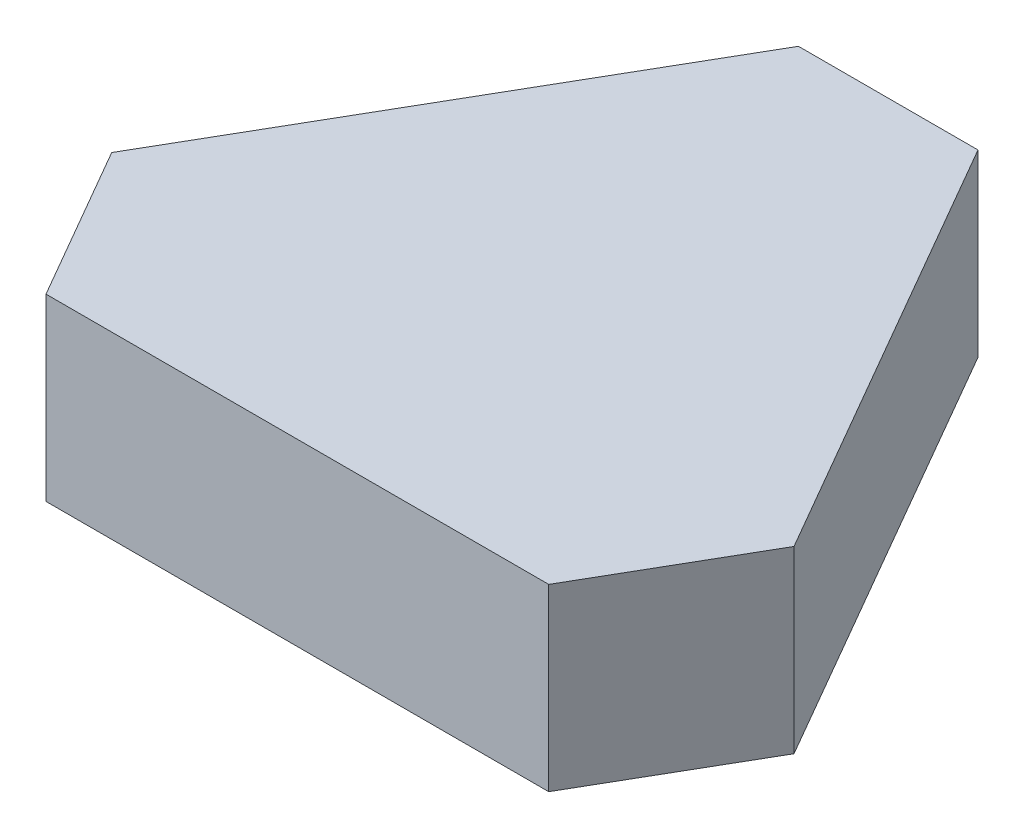
ISO-10303-21;
HEADER;
FILE_DESCRIPTION(('STEP AP214'),'2;1');
FILE_NAME('part.step','',(''),(''),'','','');
FILE_SCHEMA(('AUTOMOTIVE_DESIGN { 1 0 10303 214 1 1 1 1 }'));
ENDSEC;
DATA;
#1=APPLICATION_CONTEXT('core data for automotive mechanical design processes');
#2=APPLICATION_PROTOCOL_DEFINITION('international standard','automotive_design',2000,#1);
#3=PRODUCT_CONTEXT('',#1,'mechanical');
#4=PRODUCT('Part','Part','',(#3));
#5=PRODUCT_RELATED_PRODUCT_CATEGORY('part','',(#4));
#6=PRODUCT_DEFINITION_FORMATION('','',#4);
#7=PRODUCT_DEFINITION_CONTEXT('part definition',#1,'design');
#8=PRODUCT_DEFINITION('design','',#6,#7);
#9=PRODUCT_DEFINITION_SHAPE('','',#8);
#10=(LENGTH_UNIT() NAMED_UNIT(*) SI_UNIT(.MILLI.,.METRE.));
#11=(NAMED_UNIT(*) PLANE_ANGLE_UNIT() SI_UNIT($,.RADIAN.));
#12=(NAMED_UNIT(*) SI_UNIT($,.STERADIAN.) SOLID_ANGLE_UNIT());
#13=UNCERTAINTY_MEASURE_WITH_UNIT(LENGTH_MEASURE(1.E-05),#10,'distance_accuracy_value','');
#14=(GEOMETRIC_REPRESENTATION_CONTEXT(3) GLOBAL_UNCERTAINTY_ASSIGNED_CONTEXT((#13)) GLOBAL_UNIT_ASSIGNED_CONTEXT((#10,
#11,#12)) REPRESENTATION_CONTEXT('',''));
#15=CARTESIAN_POINT('',(0.,0.,0.));
#16=DIRECTION('',(0.,0.,1.));
#17=DIRECTION('',(1.,0.,0.));
#18=AXIS2_PLACEMENT_3D('',#15,#16,#17);
#19=CARTESIAN_POINT('',(24.,5.,13.856406460551));
#20=DIRECTION('',(0.,0.,-1.));
#21=DIRECTION('',(-1.,0.,0.));
#22=AXIS2_PLACEMENT_3D('',#19,#20,#21);
#23=PLANE('',#22);
#24=DIRECTION('',(1.,0.,0.));
#25=VECTOR('',#24,1.);
#26=CARTESIAN_POINT('',(24.,5.,13.856406460551));
#27=LINE('',#26,#25);
#28=CARTESIAN_POINT('',(-13.9999999999999,5.,13.8564064605511));
#29=VERTEX_POINT('',#28);
#30=CARTESIAN_POINT('',(14.,5.,13.856406460551));
#31=VERTEX_POINT('',#30);
#32=EDGE_CURVE('E119',#29,#31,#27,.T.);
#33=ORIENTED_EDGE('',*,*,#32,.F.);
#34=DIRECTION('',(0.,1.,0.));
#35=VECTOR('',#34,1.);
#36=CARTESIAN_POINT('',(-13.9999999999999,-18.228756555323,13.8564064605511));
#37=LINE('',#36,#35);
#38=CARTESIAN_POINT('',(-13.9999999999999,-5.,13.8564064605511));
#39=VERTEX_POINT('',#38);
#40=EDGE_CURVE('E148',#39,#29,#37,.T.);
#41=ORIENTED_EDGE('',*,*,#40,.F.);
#42=DIRECTION('',(1.,0.,0.));
#43=VECTOR('',#42,1.);
#44=CARTESIAN_POINT('',(24.,-5.,13.856406460551));
#45=LINE('',#44,#43);
#46=CARTESIAN_POINT('',(14.,-5.,13.856406460551));
#47=VERTEX_POINT('',#46);
#48=EDGE_CURVE('E124',#39,#47,#45,.T.);
#49=ORIENTED_EDGE('',*,*,#48,.T.);
#50=DIRECTION('',(0.,1.,0.));
#51=VECTOR('',#50,1.);
#52=CARTESIAN_POINT('',(14.,-18.228756555323,13.856406460551));
#53=LINE('',#52,#51);
#54=EDGE_CURVE('E128',#47,#31,#53,.T.);
#55=ORIENTED_EDGE('',*,*,#54,.T.);
#56=EDGE_LOOP('',(#33,#41,#49,#55));
#57=FACE_BOUND('',#56,.T.);
#58=ADVANCED_FACE('F45',(#57),#23,.F.);
#59=CARTESIAN_POINT('',(0.,5.,-27.712812921102));
#60=DIRECTION('',(-0.866025403784439,0.,0.5));
#61=DIRECTION('',(0.5,0.,0.866025403784439));
#62=AXIS2_PLACEMENT_3D('',#59,#60,#61);
#63=PLANE('',#62);
#64=DIRECTION('',(-0.5,0.,-0.866025403784439));
#65=VECTOR('',#64,1.);
#66=CARTESIAN_POINT('',(0.,-5.,-27.712812921102));
#67=LINE('',#66,#65);
#68=CARTESIAN_POINT('',(19.,-5.,5.19615242270663));
#69=VERTEX_POINT('',#68);
#70=CARTESIAN_POINT('',(4.99999999999997,-5.,-19.0525588832577));
#71=VERTEX_POINT('',#70);
#72=EDGE_CURVE('E120',#69,#71,#67,.T.);
#73=ORIENTED_EDGE('',*,*,#72,.T.);
#74=DIRECTION('',(0.,1.,0.));
#75=VECTOR('',#74,1.);
#76=CARTESIAN_POINT('',(4.99999999999992,-18.228756555323,-19.0525588832577));
#77=LINE('',#76,#75);
#78=CARTESIAN_POINT('',(4.99999999999992,5.,-19.0525588832577));
#79=VERTEX_POINT('',#78);
#80=EDGE_CURVE('E62',#71,#79,#77,.T.);
#81=ORIENTED_EDGE('',*,*,#80,.T.);
#82=DIRECTION('',(-0.5,0.,-0.866025403784439));
#83=VECTOR('',#82,1.);
#84=CARTESIAN_POINT('',(0.,5.,-27.712812921102));
#85=LINE('',#84,#83);
#86=CARTESIAN_POINT('',(19.,5.,5.19615242270663));
#87=VERTEX_POINT('',#86);
#88=EDGE_CURVE('E54',#87,#79,#85,.T.);
#89=ORIENTED_EDGE('',*,*,#88,.F.);
#90=DIRECTION('',(0.,1.,0.));
#91=VECTOR('',#90,1.);
#92=CARTESIAN_POINT('',(19.,-18.228756555323,5.19615242270663));
#93=LINE('',#92,#91);
#94=EDGE_CURVE('E134',#69,#87,#93,.T.);
#95=ORIENTED_EDGE('',*,*,#94,.F.);
#96=EDGE_LOOP('',(#73,#81,#89,#95));
#97=FACE_BOUND('',#96,.T.);
#98=ADVANCED_FACE('F163',(#97),#63,.F.);
#99=CARTESIAN_POINT('',(-24.,5.,13.856406460551));
#100=DIRECTION('',(0.866025403784439,0.,0.5));
#101=DIRECTION('',(0.5,0.,-0.866025403784439));
#102=AXIS2_PLACEMENT_3D('',#99,#100,#101);
#103=PLANE('',#102);
#104=DIRECTION('',(-0.5,0.,0.866025403784438));
#105=VECTOR('',#104,1.);
#106=CARTESIAN_POINT('',(-24.,5.,13.856406460551));
#107=LINE('',#106,#105);
#108=CARTESIAN_POINT('',(-5.00000000000009,5.,-19.0525588832576));
#109=VERTEX_POINT('',#108);
#110=CARTESIAN_POINT('',(-19.,5.,5.19615242270681));
#111=VERTEX_POINT('',#110);
#112=EDGE_CURVE('E11',#109,#111,#107,.T.);
#113=ORIENTED_EDGE('',*,*,#112,.F.);
#114=DIRECTION('',(0.,1.,0.));
#115=VECTOR('',#114,1.);
#116=CARTESIAN_POINT('',(-5.00000000000009,-18.228756555323,-19.0525588832576));
#117=LINE('',#116,#115);
#118=CARTESIAN_POINT('',(-5.00000000000009,-5.,-19.0525588832576));
#119=VERTEX_POINT('',#118);
#120=EDGE_CURVE('E100',#119,#109,#117,.T.);
#121=ORIENTED_EDGE('',*,*,#120,.F.);
#122=DIRECTION('',(-0.5,0.,0.866025403784438));
#123=VECTOR('',#122,1.);
#124=CARTESIAN_POINT('',(-24.,-5.,13.856406460551));
#125=LINE('',#124,#123);
#126=CARTESIAN_POINT('',(-19.0000000000001,-5.,5.19615242270675));
#127=VERTEX_POINT('',#126);
#128=EDGE_CURVE('E48',#119,#127,#125,.T.);
#129=ORIENTED_EDGE('',*,*,#128,.T.);
#130=DIRECTION('',(0.,1.,0.));
#131=VECTOR('',#130,1.);
#132=CARTESIAN_POINT('',(-19.,-18.228756555323,5.19615242270681));
#133=LINE('',#132,#131);
#134=EDGE_CURVE('E70',#127,#111,#133,.T.);
#135=ORIENTED_EDGE('',*,*,#134,.T.);
#136=EDGE_LOOP('',(#113,#121,#129,#135));
#137=FACE_BOUND('',#136,.T.);
#138=ADVANCED_FACE('F111',(#137),#103,.F.);
#139=CARTESIAN_POINT('',(0.,5.,0.));
#140=DIRECTION('',(0.,-1.,0.));
#141=DIRECTION('',(0.,0.,-1.));
#142=AXIS2_PLACEMENT_3D('',#139,#140,#141);
#143=PLANE('',#142);
#144=ORIENTED_EDGE('',*,*,#88,.T.);
#145=DIRECTION('',(1.,0.,0.));
#146=VECTOR('',#145,1.);
#147=CARTESIAN_POINT('',(4.99999999999992,5.,-19.0525588832577));
#148=LINE('',#147,#146);
#149=EDGE_CURVE('E113',#109,#79,#148,.T.);
#150=ORIENTED_EDGE('',*,*,#149,.F.);
#151=ORIENTED_EDGE('',*,*,#112,.T.);
#152=DIRECTION('',(-0.500000000000008,0.,-0.866025403784434));
#153=VECTOR('',#152,1.);
#154=CARTESIAN_POINT('',(-19.,5.,5.19615242270681));
#155=LINE('',#154,#153);
#156=EDGE_CURVE('E151',#29,#111,#155,.T.);
#157=ORIENTED_EDGE('',*,*,#156,.F.);
#158=ORIENTED_EDGE('',*,*,#32,.T.);
#159=DIRECTION('',(-0.5,0.,0.866025403784439));
#160=VECTOR('',#159,1.);
#161=CARTESIAN_POINT('',(14.,5.,13.856406460551));
#162=LINE('',#161,#160);
#163=EDGE_CURVE('E138',#87,#31,#162,.T.);
#164=ORIENTED_EDGE('',*,*,#163,.F.);
#165=EDGE_LOOP('',(#144,#150,#151,#157,#158,#164));
#166=FACE_BOUND('',#165,.T.);
#167=ADVANCED_FACE('F165',(#166),#143,.F.);
#168=CARTESIAN_POINT('',(0.,-5.,0.));
#169=DIRECTION('',(0.,-1.,0.));
#170=DIRECTION('',(0.,0.,-1.));
#171=AXIS2_PLACEMENT_3D('',#168,#169,#170);
#172=PLANE('',#171);
#173=DIRECTION('',(1.,0.,0.));
#174=VECTOR('',#173,1.);
#175=CARTESIAN_POINT('',(4.99999999999992,-5.,-19.0525588832577));
#176=LINE('',#175,#174);
#177=EDGE_CURVE('E97',#119,#71,#176,.T.);
#178=ORIENTED_EDGE('',*,*,#177,.T.);
#179=ORIENTED_EDGE('',*,*,#72,.F.);
#180=DIRECTION('',(-0.5,0.,0.866025403784439));
#181=VECTOR('',#180,1.);
#182=CARTESIAN_POINT('',(14.,-5.,13.856406460551));
#183=LINE('',#182,#181);
#184=EDGE_CURVE('E137',#69,#47,#183,.T.);
#185=ORIENTED_EDGE('',*,*,#184,.T.);
#186=ORIENTED_EDGE('',*,*,#48,.F.);
#187=DIRECTION('',(-0.500000000000008,0.,-0.866025403784434));
#188=VECTOR('',#187,1.);
#189=CARTESIAN_POINT('',(-19.,-5.,5.19615242270681));
#190=LINE('',#189,#188);
#191=EDGE_CURVE('E117',#39,#127,#190,.T.);
#192=ORIENTED_EDGE('',*,*,#191,.T.);
#193=ORIENTED_EDGE('',*,*,#128,.F.);
#194=EDGE_LOOP('',(#178,#179,#185,#186,#192,#193));
#195=FACE_BOUND('',#194,.T.);
#196=ADVANCED_FACE('F115',(#195),#172,.T.);
#197=CARTESIAN_POINT('',(14.,-18.228756555323,13.856406460551));
#198=DIRECTION('',(-0.866025403784439,0.,-0.5));
#199=DIRECTION('',(-0.5,0.,0.866025403784439));
#200=AXIS2_PLACEMENT_3D('',#197,#198,#199);
#201=PLANE('',#200);
#202=ORIENTED_EDGE('',*,*,#94,.T.);
#203=ORIENTED_EDGE('',*,*,#163,.T.);
#204=ORIENTED_EDGE('',*,*,#54,.F.);
#205=ORIENTED_EDGE('',*,*,#184,.F.);
#206=EDGE_LOOP('',(#202,#203,#204,#205));
#207=FACE_BOUND('',#206,.T.);
#208=ADVANCED_FACE('F170',(#207),#201,.F.);
#209=CARTESIAN_POINT('',(-19.,-18.228756555323,5.19615242270681));
#210=DIRECTION('',(0.866025403784434,0.,-0.500000000000008));
#211=DIRECTION('',(-0.500000000000008,0.,-0.866025403784434));
#212=AXIS2_PLACEMENT_3D('',#209,#210,#211);
#213=PLANE('',#212);
#214=ORIENTED_EDGE('',*,*,#40,.T.);
#215=ORIENTED_EDGE('',*,*,#156,.T.);
#216=ORIENTED_EDGE('',*,*,#134,.F.);
#217=ORIENTED_EDGE('',*,*,#191,.F.);
#218=EDGE_LOOP('',(#214,#215,#216,#217));
#219=FACE_BOUND('',#218,.T.);
#220=ADVANCED_FACE('F173',(#219),#213,.F.);
#221=CARTESIAN_POINT('',(4.99999999999992,-18.228756555323,-19.0525588832577));
#222=DIRECTION('',(0.,0.,1.));
#223=DIRECTION('',(1.,0.,0.));
#224=AXIS2_PLACEMENT_3D('',#221,#222,#223);
#225=PLANE('',#224);
#226=ORIENTED_EDGE('',*,*,#120,.T.);
#227=ORIENTED_EDGE('',*,*,#149,.T.);
#228=ORIENTED_EDGE('',*,*,#80,.F.);
#229=ORIENTED_EDGE('',*,*,#177,.F.);
#230=EDGE_LOOP('',(#226,#227,#228,#229));
#231=FACE_BOUND('',#230,.T.);
#232=ADVANCED_FACE('F99',(#231),#225,.F.);
#233=CLOSED_SHELL('',(#58,#98,#138,#167,#196,#208,#220,#232));
#234=MANIFOLD_SOLID_BREP('B2',#233);
#235=ADVANCED_BREP_SHAPE_REPRESENTATION('',(#18,#234),#14);
#236=SHAPE_DEFINITION_REPRESENTATION(#9,#235);
ENDSEC;
END-ISO-10303-21;
